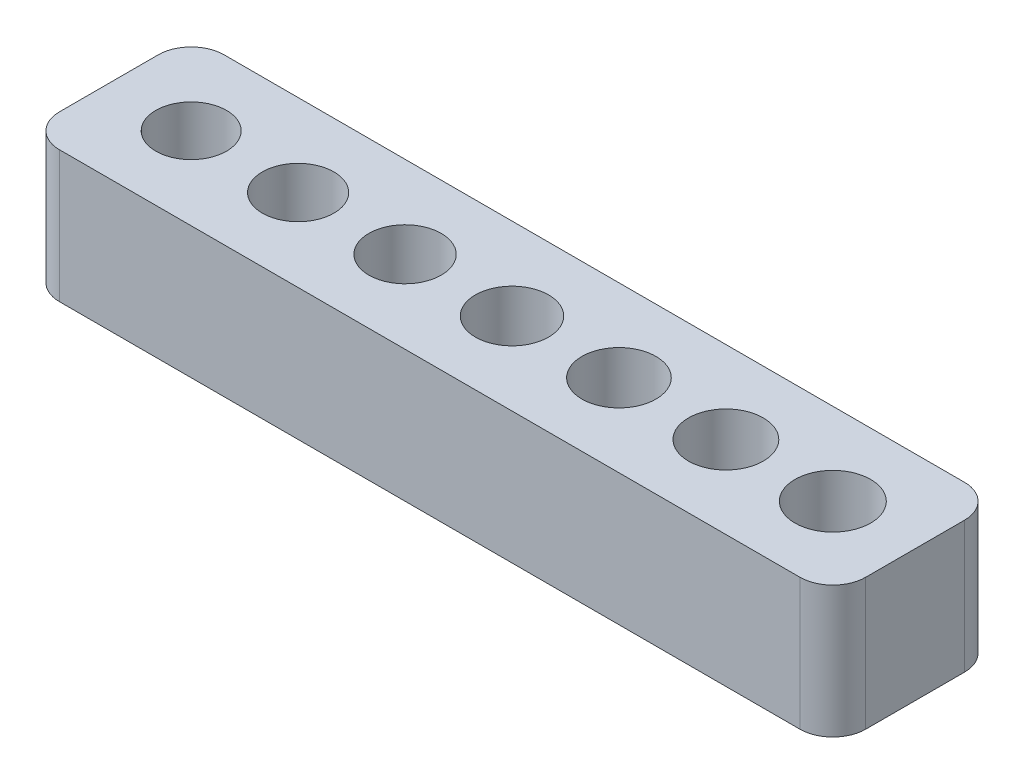
ISO-10303-21;
HEADER;
FILE_DESCRIPTION(('STEP AP214'),'2;1');
FILE_NAME('part.step','',(''),(''),'','','');
FILE_SCHEMA(('AUTOMOTIVE_DESIGN { 1 0 10303 214 1 1 1 1 }'));
ENDSEC;
DATA;
#1=APPLICATION_CONTEXT('core data for automotive mechanical design processes');
#2=APPLICATION_PROTOCOL_DEFINITION('international standard','automotive_design',2000,#1);
#3=PRODUCT_CONTEXT('',#1,'mechanical');
#4=PRODUCT('Part','Part','',(#3));
#5=PRODUCT_RELATED_PRODUCT_CATEGORY('part','',(#4));
#6=PRODUCT_DEFINITION_FORMATION('','',#4);
#7=PRODUCT_DEFINITION_CONTEXT('part definition',#1,'design');
#8=PRODUCT_DEFINITION('design','',#6,#7);
#9=PRODUCT_DEFINITION_SHAPE('','',#8);
#10=(LENGTH_UNIT() NAMED_UNIT(*) SI_UNIT(.MILLI.,.METRE.));
#11=(NAMED_UNIT(*) PLANE_ANGLE_UNIT() SI_UNIT($,.RADIAN.));
#12=(NAMED_UNIT(*) SI_UNIT($,.STERADIAN.) SOLID_ANGLE_UNIT());
#13=UNCERTAINTY_MEASURE_WITH_UNIT(LENGTH_MEASURE(1.E-05),#10,'distance_accuracy_value','');
#14=(GEOMETRIC_REPRESENTATION_CONTEXT(3) GLOBAL_UNCERTAINTY_ASSIGNED_CONTEXT((#13)) GLOBAL_UNIT_ASSIGNED_CONTEXT((#10,
#11,#12)) REPRESENTATION_CONTEXT('',''));
#15=CARTESIAN_POINT('',(0.,0.,0.));
#16=DIRECTION('',(0.,0.,1.));
#17=DIRECTION('',(1.,0.,0.));
#18=AXIS2_PLACEMENT_3D('',#15,#16,#17);
#19=CARTESIAN_POINT('',(0.,8.,0.));
#20=DIRECTION('',(0.,-1.,0.));
#21=DIRECTION('',(0.,0.,-1.));
#22=AXIS2_PLACEMENT_3D('',#19,#20,#21);
#23=PLANE('',#22);
#24=DIRECTION('',(1.,0.,0.));
#25=VECTOR('',#24,1.);
#26=CARTESIAN_POINT('',(0.,8.,0.));
#27=LINE('',#26,#25);
#28=CARTESIAN_POINT('',(2.,8.,0.));
#29=VERTEX_POINT('',#28);
#30=CARTESIAN_POINT('',(47.,8.,0.));
#31=VERTEX_POINT('',#30);
#32=EDGE_CURVE('E201',#29,#31,#27,.T.);
#33=ORIENTED_EDGE('',*,*,#32,.T.);
#34=CARTESIAN_POINT('',(47.,8.,-2.));
#35=DIRECTION('',(0.,-1.,0.));
#36=DIRECTION('',(0.,0.,-1.));
#37=AXIS2_PLACEMENT_3D('',#34,#35,#36);
#38=CIRCLE('',#37,2.);
#39=CARTESIAN_POINT('',(49.,8.,-2.));
#40=VERTEX_POINT('',#39);
#41=EDGE_CURVE('E174',#31,#40,#38,.F.);
#42=ORIENTED_EDGE('',*,*,#41,.T.);
#43=DIRECTION('',(0.,0.,-1.));
#44=VECTOR('',#43,1.);
#45=CARTESIAN_POINT('',(49.,8.,0.));
#46=LINE('',#45,#44);
#47=CARTESIAN_POINT('',(49.,8.,-8.));
#48=VERTEX_POINT('',#47);
#49=EDGE_CURVE('E131',#40,#48,#46,.T.);
#50=ORIENTED_EDGE('',*,*,#49,.T.);
#51=CARTESIAN_POINT('',(47.,8.,-8.));
#52=DIRECTION('',(0.,-1.,0.));
#53=DIRECTION('',(0.,0.,-1.));
#54=AXIS2_PLACEMENT_3D('',#51,#52,#53);
#55=CIRCLE('',#54,2.);
#56=CARTESIAN_POINT('',(47.,8.,-10.));
#57=VERTEX_POINT('',#56);
#58=EDGE_CURVE('E66',#48,#57,#55,.F.);
#59=ORIENTED_EDGE('',*,*,#58,.T.);
#60=DIRECTION('',(-1.,0.,0.));
#61=VECTOR('',#60,1.);
#62=CARTESIAN_POINT('',(0.,8.,-10.));
#63=LINE('',#62,#61);
#64=CARTESIAN_POINT('',(2.,8.,-10.));
#65=VERTEX_POINT('',#64);
#66=EDGE_CURVE('E153',#57,#65,#63,.T.);
#67=ORIENTED_EDGE('',*,*,#66,.T.);
#68=CARTESIAN_POINT('',(2.,8.,-8.));
#69=DIRECTION('',(0.,-1.,0.));
#70=DIRECTION('',(0.,0.,-1.));
#71=AXIS2_PLACEMENT_3D('',#68,#69,#70);
#72=CIRCLE('',#71,2.);
#73=CARTESIAN_POINT('',(0.,8.,-8.));
#74=VERTEX_POINT('',#73);
#75=EDGE_CURVE('E171',#65,#74,#72,.F.);
#76=ORIENTED_EDGE('',*,*,#75,.T.);
#77=DIRECTION('',(0.,0.,1.));
#78=VECTOR('',#77,1.);
#79=CARTESIAN_POINT('',(0.,8.,0.));
#80=LINE('',#79,#78);
#81=CARTESIAN_POINT('',(0.,8.,-2.));
#82=VERTEX_POINT('',#81);
#83=EDGE_CURVE('E146',#74,#82,#80,.T.);
#84=ORIENTED_EDGE('',*,*,#83,.T.);
#85=CARTESIAN_POINT('',(2.,8.,-2.));
#86=DIRECTION('',(0.,-1.,0.));
#87=DIRECTION('',(0.,0.,-1.));
#88=AXIS2_PLACEMENT_3D('',#85,#86,#87);
#89=CIRCLE('',#88,2.);
#90=EDGE_CURVE('E166',#82,#29,#89,.F.);
#91=ORIENTED_EDGE('',*,*,#90,.T.);
#92=EDGE_LOOP('',(#33,#42,#50,#59,#67,#76,#84,#91));
#93=FACE_BOUND('',#92,.T.);
#94=CARTESIAN_POINT('',(37.5,8.,-5.));
#95=DIRECTION('',(0.,1.,0.));
#96=DIRECTION('',(0.,0.,1.));
#97=AXIS2_PLACEMENT_3D('',#94,#95,#96);
#98=CIRCLE('',#97,2.275);
#99=CARTESIAN_POINT('',(37.5,8.,-2.725));
#100=VERTEX_POINT('',#99);
#101=EDGE_CURVE('E214',#100,#100,#98,.T.);
#102=ORIENTED_EDGE('',*,*,#101,.F.);
#103=EDGE_LOOP('',(#102));
#104=FACE_BOUND('',#103,.T.);
#105=CARTESIAN_POINT('',(31.,8.,-5.));
#106=DIRECTION('',(0.,1.,0.));
#107=DIRECTION('',(0.,0.,1.));
#108=AXIS2_PLACEMENT_3D('',#105,#106,#107);
#109=CIRCLE('',#108,2.25000000000001);
#110=CARTESIAN_POINT('',(31.,8.,-2.74999999999999));
#111=VERTEX_POINT('',#110);
#112=EDGE_CURVE('E221',#111,#111,#109,.T.);
#113=ORIENTED_EDGE('',*,*,#112,.F.);
#114=EDGE_LOOP('',(#113));
#115=FACE_BOUND('',#114,.T.);
#116=CARTESIAN_POINT('',(5.,8.,-5.));
#117=DIRECTION('',(0.,1.,0.));
#118=DIRECTION('',(0.,0.,1.));
#119=AXIS2_PLACEMENT_3D('',#116,#117,#118);
#120=CIRCLE('',#119,2.15);
#121=CARTESIAN_POINT('',(5.,8.,-2.85));
#122=VERTEX_POINT('',#121);
#123=EDGE_CURVE('E227',#122,#122,#120,.T.);
#124=ORIENTED_EDGE('',*,*,#123,.F.);
#125=EDGE_LOOP('',(#124));
#126=FACE_BOUND('',#125,.T.);
#127=CARTESIAN_POINT('',(11.5,8.,-5.));
#128=DIRECTION('',(0.,1.,0.));
#129=DIRECTION('',(0.,0.,1.));
#130=AXIS2_PLACEMENT_3D('',#127,#128,#129);
#131=CIRCLE('',#130,2.175);
#132=CARTESIAN_POINT('',(11.5,8.,-2.825));
#133=VERTEX_POINT('',#132);
#134=EDGE_CURVE('E235',#133,#133,#131,.T.);
#135=ORIENTED_EDGE('',*,*,#134,.F.);
#136=EDGE_LOOP('',(#135));
#137=FACE_BOUND('',#136,.T.);
#138=CARTESIAN_POINT('',(18.,8.,-5.));
#139=DIRECTION('',(0.,1.,0.));
#140=DIRECTION('',(0.,0.,1.));
#141=AXIS2_PLACEMENT_3D('',#138,#139,#140);
#142=CIRCLE('',#141,2.20000000000001);
#143=CARTESIAN_POINT('',(18.,8.,-2.79999999999999));
#144=VERTEX_POINT('',#143);
#145=EDGE_CURVE('E243',#144,#144,#142,.T.);
#146=ORIENTED_EDGE('',*,*,#145,.F.);
#147=EDGE_LOOP('',(#146));
#148=FACE_BOUND('',#147,.T.);
#149=CARTESIAN_POINT('',(24.5,8.,-5.));
#150=DIRECTION('',(0.,1.,0.));
#151=DIRECTION('',(0.,0.,1.));
#152=AXIS2_PLACEMENT_3D('',#149,#150,#151);
#153=CIRCLE('',#152,2.225);
#154=CARTESIAN_POINT('',(24.5,8.,-2.775));
#155=VERTEX_POINT('',#154);
#156=EDGE_CURVE('E251',#155,#155,#153,.T.);
#157=ORIENTED_EDGE('',*,*,#156,.F.);
#158=EDGE_LOOP('',(#157));
#159=FACE_BOUND('',#158,.T.);
#160=CARTESIAN_POINT('',(44.,8.,-5.));
#161=DIRECTION('',(0.,1.,0.));
#162=DIRECTION('',(0.,0.,1.));
#163=AXIS2_PLACEMENT_3D('',#160,#161,#162);
#164=CIRCLE('',#163,2.30000000000001);
#165=CARTESIAN_POINT('',(44.,8.,-2.69999999999999));
#166=VERTEX_POINT('',#165);
#167=EDGE_CURVE('E259',#166,#166,#164,.T.);
#168=ORIENTED_EDGE('',*,*,#167,.F.);
#169=EDGE_LOOP('',(#168));
#170=FACE_BOUND('',#169,.T.);
#171=ADVANCED_FACE('F45',(#93,#104,#115,#126,#137,#148,#159,#170),#23,.F.);
#172=CARTESIAN_POINT('',(0.,0.,0.));
#173=DIRECTION('',(0.,-1.,0.));
#174=DIRECTION('',(0.,0.,-1.));
#175=AXIS2_PLACEMENT_3D('',#172,#173,#174);
#176=PLANE('',#175);
#177=CARTESIAN_POINT('',(24.5,0.,-5.));
#178=DIRECTION('',(0.,1.,0.));
#179=DIRECTION('',(0.,0.,1.));
#180=AXIS2_PLACEMENT_3D('',#177,#178,#179);
#181=CIRCLE('',#180,2.225);
#182=CARTESIAN_POINT('',(24.5,0.,-2.775));
#183=VERTEX_POINT('',#182);
#184=EDGE_CURVE('E255',#183,#183,#181,.T.);
#185=ORIENTED_EDGE('',*,*,#184,.T.);
#186=EDGE_LOOP('',(#185));
#187=FACE_BOUND('',#186,.T.);
#188=CARTESIAN_POINT('',(11.5,0.,-5.));
#189=DIRECTION('',(0.,1.,0.));
#190=DIRECTION('',(0.,0.,1.));
#191=AXIS2_PLACEMENT_3D('',#188,#189,#190);
#192=CIRCLE('',#191,2.175);
#193=CARTESIAN_POINT('',(11.5,0.,-2.825));
#194=VERTEX_POINT('',#193);
#195=EDGE_CURVE('E239',#194,#194,#192,.T.);
#196=ORIENTED_EDGE('',*,*,#195,.T.);
#197=EDGE_LOOP('',(#196));
#198=FACE_BOUND('',#197,.T.);
#199=CARTESIAN_POINT('',(31.,0.,-5.));
#200=DIRECTION('',(0.,1.,0.));
#201=DIRECTION('',(0.,0.,1.));
#202=AXIS2_PLACEMENT_3D('',#199,#200,#201);
#203=CIRCLE('',#202,2.25000000000001);
#204=CARTESIAN_POINT('',(31.,0.,-2.74999999999999));
#205=VERTEX_POINT('',#204);
#206=EDGE_CURVE('E223',#205,#205,#203,.T.);
#207=ORIENTED_EDGE('',*,*,#206,.T.);
#208=EDGE_LOOP('',(#207));
#209=FACE_BOUND('',#208,.T.);
#210=DIRECTION('',(0.,0.,-1.));
#211=VECTOR('',#210,1.);
#212=CARTESIAN_POINT('',(49.,0.,0.));
#213=LINE('',#212,#211);
#214=CARTESIAN_POINT('',(49.,0.,-2.));
#215=VERTEX_POINT('',#214);
#216=CARTESIAN_POINT('',(49.,0.,-8.));
#217=VERTEX_POINT('',#216);
#218=EDGE_CURVE('E129',#215,#217,#213,.T.);
#219=ORIENTED_EDGE('',*,*,#218,.F.);
#220=CARTESIAN_POINT('',(47.,0.,-2.));
#221=DIRECTION('',(0.,-1.,0.));
#222=DIRECTION('',(0.,0.,-1.));
#223=AXIS2_PLACEMENT_3D('',#220,#221,#222);
#224=CIRCLE('',#223,2.);
#225=CARTESIAN_POINT('',(47.,0.,0.));
#226=VERTEX_POINT('',#225);
#227=EDGE_CURVE('E111',#215,#226,#224,.T.);
#228=ORIENTED_EDGE('',*,*,#227,.T.);
#229=DIRECTION('',(1.,0.,0.));
#230=VECTOR('',#229,1.);
#231=CARTESIAN_POINT('',(0.,0.,0.));
#232=LINE('',#231,#230);
#233=CARTESIAN_POINT('',(2.,0.,0.));
#234=VERTEX_POINT('',#233);
#235=EDGE_CURVE('E142',#234,#226,#232,.T.);
#236=ORIENTED_EDGE('',*,*,#235,.F.);
#237=CARTESIAN_POINT('',(2.,0.,-2.));
#238=DIRECTION('',(0.,-1.,0.));
#239=DIRECTION('',(0.,0.,-1.));
#240=AXIS2_PLACEMENT_3D('',#237,#238,#239);
#241=CIRCLE('',#240,2.);
#242=CARTESIAN_POINT('',(0.,0.,-2.));
#243=VERTEX_POINT('',#242);
#244=EDGE_CURVE('E133',#234,#243,#241,.T.);
#245=ORIENTED_EDGE('',*,*,#244,.T.);
#246=DIRECTION('',(0.,0.,1.));
#247=VECTOR('',#246,1.);
#248=CARTESIAN_POINT('',(0.,0.,0.));
#249=LINE('',#248,#247);
#250=CARTESIAN_POINT('',(0.,0.,-8.));
#251=VERTEX_POINT('',#250);
#252=EDGE_CURVE('E148',#251,#243,#249,.T.);
#253=ORIENTED_EDGE('',*,*,#252,.F.);
#254=CARTESIAN_POINT('',(2.,0.,-8.));
#255=DIRECTION('',(0.,-1.,0.));
#256=DIRECTION('',(0.,0.,-1.));
#257=AXIS2_PLACEMENT_3D('',#254,#255,#256);
#258=CIRCLE('',#257,2.);
#259=CARTESIAN_POINT('',(2.,0.,-10.));
#260=VERTEX_POINT('',#259);
#261=EDGE_CURVE('E123',#251,#260,#258,.T.);
#262=ORIENTED_EDGE('',*,*,#261,.T.);
#263=DIRECTION('',(-1.,0.,0.));
#264=VECTOR('',#263,1.);
#265=CARTESIAN_POINT('',(0.,0.,-10.));
#266=LINE('',#265,#264);
#267=CARTESIAN_POINT('',(47.,0.,-10.));
#268=VERTEX_POINT('',#267);
#269=EDGE_CURVE('E141',#268,#260,#266,.T.);
#270=ORIENTED_EDGE('',*,*,#269,.F.);
#271=CARTESIAN_POINT('',(47.,0.,-8.));
#272=DIRECTION('',(0.,-1.,0.));
#273=DIRECTION('',(0.,0.,-1.));
#274=AXIS2_PLACEMENT_3D('',#271,#272,#273);
#275=CIRCLE('',#274,2.);
#276=EDGE_CURVE('E139',#268,#217,#275,.T.);
#277=ORIENTED_EDGE('',*,*,#276,.T.);
#278=EDGE_LOOP('',(#219,#228,#236,#245,#253,#262,#270,#277));
#279=FACE_BOUND('',#278,.T.);
#280=CARTESIAN_POINT('',(37.5,0.,-5.));
#281=DIRECTION('',(0.,1.,0.));
#282=DIRECTION('',(0.,0.,1.));
#283=AXIS2_PLACEMENT_3D('',#280,#281,#282);
#284=CIRCLE('',#283,2.275);
#285=CARTESIAN_POINT('',(37.5,0.,-2.725));
#286=VERTEX_POINT('',#285);
#287=EDGE_CURVE('E207',#286,#286,#284,.T.);
#288=ORIENTED_EDGE('',*,*,#287,.T.);
#289=EDGE_LOOP('',(#288));
#290=FACE_BOUND('',#289,.T.);
#291=CARTESIAN_POINT('',(5.,0.,-5.));
#292=DIRECTION('',(0.,1.,0.));
#293=DIRECTION('',(0.,0.,1.));
#294=AXIS2_PLACEMENT_3D('',#291,#292,#293);
#295=CIRCLE('',#294,2.15);
#296=CARTESIAN_POINT('',(5.,0.,-2.85));
#297=VERTEX_POINT('',#296);
#298=EDGE_CURVE('E231',#297,#297,#295,.T.);
#299=ORIENTED_EDGE('',*,*,#298,.T.);
#300=EDGE_LOOP('',(#299));
#301=FACE_BOUND('',#300,.T.);
#302=CARTESIAN_POINT('',(18.,0.,-5.));
#303=DIRECTION('',(0.,1.,0.));
#304=DIRECTION('',(0.,0.,1.));
#305=AXIS2_PLACEMENT_3D('',#302,#303,#304);
#306=CIRCLE('',#305,2.20000000000001);
#307=CARTESIAN_POINT('',(18.,0.,-2.79999999999999));
#308=VERTEX_POINT('',#307);
#309=EDGE_CURVE('E247',#308,#308,#306,.T.);
#310=ORIENTED_EDGE('',*,*,#309,.T.);
#311=EDGE_LOOP('',(#310));
#312=FACE_BOUND('',#311,.T.);
#313=CARTESIAN_POINT('',(44.,0.,-5.));
#314=DIRECTION('',(0.,1.,0.));
#315=DIRECTION('',(0.,0.,1.));
#316=AXIS2_PLACEMENT_3D('',#313,#314,#315);
#317=CIRCLE('',#316,2.30000000000001);
#318=CARTESIAN_POINT('',(44.,0.,-2.69999999999999));
#319=VERTEX_POINT('',#318);
#320=EDGE_CURVE('E263',#319,#319,#317,.T.);
#321=ORIENTED_EDGE('',*,*,#320,.T.);
#322=EDGE_LOOP('',(#321));
#323=FACE_BOUND('',#322,.T.);
#324=ADVANCED_FACE('F136',(#187,#198,#209,#279,#290,#301,#312,#323),#176,.T.);
#325=CARTESIAN_POINT('',(0.,8.,0.));
#326=DIRECTION('',(1.,0.,0.));
#327=DIRECTION('',(0.,0.,-1.));
#328=AXIS2_PLACEMENT_3D('',#325,#326,#327);
#329=PLANE('',#328);
#330=ORIENTED_EDGE('',*,*,#83,.F.);
#331=DIRECTION('',(0.,-1.,0.));
#332=VECTOR('',#331,1.);
#333=CARTESIAN_POINT('',(0.,8.,-8.));
#334=LINE('',#333,#332);
#335=EDGE_CURVE('E180',#74,#251,#334,.T.);
#336=ORIENTED_EDGE('',*,*,#335,.T.);
#337=ORIENTED_EDGE('',*,*,#252,.T.);
#338=DIRECTION('',(0.,-1.,0.));
#339=VECTOR('',#338,1.);
#340=CARTESIAN_POINT('',(0.,8.,-2.));
#341=LINE('',#340,#339);
#342=EDGE_CURVE('E177',#243,#82,#341,.F.);
#343=ORIENTED_EDGE('',*,*,#342,.T.);
#344=EDGE_LOOP('',(#330,#336,#337,#343));
#345=FACE_BOUND('',#344,.T.);
#346=ADVANCED_FACE('F196',(#345),#329,.F.);
#347=CARTESIAN_POINT('',(0.,8.,0.));
#348=DIRECTION('',(0.,0.,-1.));
#349=DIRECTION('',(-1.,0.,0.));
#350=AXIS2_PLACEMENT_3D('',#347,#348,#349);
#351=PLANE('',#350);
#352=ORIENTED_EDGE('',*,*,#235,.T.);
#353=DIRECTION('',(0.,-1.,0.));
#354=VECTOR('',#353,1.);
#355=CARTESIAN_POINT('',(47.,8.,0.));
#356=LINE('',#355,#354);
#357=EDGE_CURVE('E116',#226,#31,#356,.F.);
#358=ORIENTED_EDGE('',*,*,#357,.T.);
#359=ORIENTED_EDGE('',*,*,#32,.F.);
#360=DIRECTION('',(0.,-1.,0.));
#361=VECTOR('',#360,1.);
#362=CARTESIAN_POINT('',(2.,8.,0.));
#363=LINE('',#362,#361);
#364=EDGE_CURVE('E122',#29,#234,#363,.T.);
#365=ORIENTED_EDGE('',*,*,#364,.T.);
#366=EDGE_LOOP('',(#352,#358,#359,#365));
#367=FACE_BOUND('',#366,.T.);
#368=ADVANCED_FACE('F291',(#367),#351,.F.);
#369=CARTESIAN_POINT('',(49.,8.,0.));
#370=DIRECTION('',(-1.,0.,0.));
#371=DIRECTION('',(0.,0.,1.));
#372=AXIS2_PLACEMENT_3D('',#369,#370,#371);
#373=PLANE('',#372);
#374=ORIENTED_EDGE('',*,*,#49,.F.);
#375=DIRECTION('',(0.,-1.,0.));
#376=VECTOR('',#375,1.);
#377=CARTESIAN_POINT('',(49.,8.,-2.));
#378=LINE('',#377,#376);
#379=EDGE_CURVE('E115',#40,#215,#378,.T.);
#380=ORIENTED_EDGE('',*,*,#379,.T.);
#381=ORIENTED_EDGE('',*,*,#218,.T.);
#382=DIRECTION('',(0.,-1.,0.));
#383=VECTOR('',#382,1.);
#384=CARTESIAN_POINT('',(49.,8.,-8.));
#385=LINE('',#384,#383);
#386=EDGE_CURVE('E134',#217,#48,#385,.F.);
#387=ORIENTED_EDGE('',*,*,#386,.T.);
#388=EDGE_LOOP('',(#374,#380,#381,#387));
#389=FACE_BOUND('',#388,.T.);
#390=ADVANCED_FACE('F128',(#389),#373,.F.);
#391=CARTESIAN_POINT('',(0.,8.,-10.));
#392=DIRECTION('',(0.,0.,1.));
#393=DIRECTION('',(1.,0.,0.));
#394=AXIS2_PLACEMENT_3D('',#391,#392,#393);
#395=PLANE('',#394);
#396=ORIENTED_EDGE('',*,*,#269,.T.);
#397=DIRECTION('',(0.,-1.,0.));
#398=VECTOR('',#397,1.);
#399=CARTESIAN_POINT('',(2.,8.,-10.));
#400=LINE('',#399,#398);
#401=EDGE_CURVE('E11',#260,#65,#400,.F.);
#402=ORIENTED_EDGE('',*,*,#401,.T.);
#403=ORIENTED_EDGE('',*,*,#66,.F.);
#404=DIRECTION('',(0.,-1.,0.));
#405=VECTOR('',#404,1.);
#406=CARTESIAN_POINT('',(47.,8.,-10.));
#407=LINE('',#406,#405);
#408=EDGE_CURVE('E54',#57,#268,#407,.T.);
#409=ORIENTED_EDGE('',*,*,#408,.T.);
#410=EDGE_LOOP('',(#396,#402,#403,#409));
#411=FACE_BOUND('',#410,.T.);
#412=ADVANCED_FACE('F186',(#411),#395,.F.);
#413=CARTESIAN_POINT('',(37.5,8.,-5.));
#414=DIRECTION('',(0.,-1.,0.));
#415=DIRECTION('',(0.,0.,-1.));
#416=AXIS2_PLACEMENT_3D('',#413,#414,#415);
#417=CYLINDRICAL_SURFACE('',#416,2.275);
#418=ORIENTED_EDGE('',*,*,#101,.T.);
#419=EDGE_LOOP('',(#418));
#420=FACE_BOUND('',#419,.T.);
#421=ORIENTED_EDGE('',*,*,#287,.F.);
#422=EDGE_LOOP('',(#421));
#423=FACE_BOUND('',#422,.T.);
#424=ADVANCED_FACE('F284',(#420,#423),#417,.F.);
#425=CARTESIAN_POINT('',(31.,8.,-5.));
#426=DIRECTION('',(0.,-1.,0.));
#427=DIRECTION('',(0.,0.,-1.));
#428=AXIS2_PLACEMENT_3D('',#425,#426,#427);
#429=CYLINDRICAL_SURFACE('',#428,2.25000000000001);
#430=ORIENTED_EDGE('',*,*,#112,.T.);
#431=EDGE_LOOP('',(#430));
#432=FACE_BOUND('',#431,.T.);
#433=ORIENTED_EDGE('',*,*,#206,.F.);
#434=EDGE_LOOP('',(#433));
#435=FACE_BOUND('',#434,.T.);
#436=ADVANCED_FACE('F374',(#432,#435),#429,.F.);
#437=CARTESIAN_POINT('',(5.,8.,-5.));
#438=DIRECTION('',(0.,-1.,0.));
#439=DIRECTION('',(0.,0.,-1.));
#440=AXIS2_PLACEMENT_3D('',#437,#438,#439);
#441=CYLINDRICAL_SURFACE('',#440,2.15);
#442=ORIENTED_EDGE('',*,*,#123,.T.);
#443=EDGE_LOOP('',(#442));
#444=FACE_BOUND('',#443,.T.);
#445=ORIENTED_EDGE('',*,*,#298,.F.);
#446=EDGE_LOOP('',(#445));
#447=FACE_BOUND('',#446,.T.);
#448=ADVANCED_FACE('F364',(#444,#447),#441,.F.);
#449=CARTESIAN_POINT('',(11.5,8.,-5.));
#450=DIRECTION('',(0.,-1.,0.));
#451=DIRECTION('',(0.,0.,-1.));
#452=AXIS2_PLACEMENT_3D('',#449,#450,#451);
#453=CYLINDRICAL_SURFACE('',#452,2.175);
#454=ORIENTED_EDGE('',*,*,#134,.T.);
#455=EDGE_LOOP('',(#454));
#456=FACE_BOUND('',#455,.T.);
#457=ORIENTED_EDGE('',*,*,#195,.F.);
#458=EDGE_LOOP('',(#457));
#459=FACE_BOUND('',#458,.T.);
#460=ADVANCED_FACE('F354',(#456,#459),#453,.F.);
#461=CARTESIAN_POINT('',(18.,8.,-5.));
#462=DIRECTION('',(0.,-1.,0.));
#463=DIRECTION('',(0.,0.,-1.));
#464=AXIS2_PLACEMENT_3D('',#461,#462,#463);
#465=CYLINDRICAL_SURFACE('',#464,2.20000000000001);
#466=ORIENTED_EDGE('',*,*,#145,.T.);
#467=EDGE_LOOP('',(#466));
#468=FACE_BOUND('',#467,.T.);
#469=ORIENTED_EDGE('',*,*,#309,.F.);
#470=EDGE_LOOP('',(#469));
#471=FACE_BOUND('',#470,.T.);
#472=ADVANCED_FACE('F344',(#468,#471),#465,.F.);
#473=CARTESIAN_POINT('',(24.5,8.,-5.));
#474=DIRECTION('',(0.,-1.,0.));
#475=DIRECTION('',(0.,0.,-1.));
#476=AXIS2_PLACEMENT_3D('',#473,#474,#475);
#477=CYLINDRICAL_SURFACE('',#476,2.225);
#478=ORIENTED_EDGE('',*,*,#156,.T.);
#479=EDGE_LOOP('',(#478));
#480=FACE_BOUND('',#479,.T.);
#481=ORIENTED_EDGE('',*,*,#184,.F.);
#482=EDGE_LOOP('',(#481));
#483=FACE_BOUND('',#482,.T.);
#484=ADVANCED_FACE('F335',(#480,#483),#477,.F.);
#485=CARTESIAN_POINT('',(44.,8.,-5.));
#486=DIRECTION('',(0.,-1.,0.));
#487=DIRECTION('',(0.,0.,-1.));
#488=AXIS2_PLACEMENT_3D('',#485,#486,#487);
#489=CYLINDRICAL_SURFACE('',#488,2.30000000000001);
#490=ORIENTED_EDGE('',*,*,#167,.T.);
#491=EDGE_LOOP('',(#490));
#492=FACE_BOUND('',#491,.T.);
#493=ORIENTED_EDGE('',*,*,#320,.F.);
#494=EDGE_LOOP('',(#493));
#495=FACE_BOUND('',#494,.T.);
#496=ADVANCED_FACE('F271',(#492,#495),#489,.F.);
#497=CARTESIAN_POINT('',(47.,8.,-2.));
#498=DIRECTION('',(0.,-1.,0.));
#499=DIRECTION('',(0.,0.,-1.));
#500=AXIS2_PLACEMENT_3D('',#497,#498,#499);
#501=CYLINDRICAL_SURFACE('',#500,2.);
#502=ORIENTED_EDGE('',*,*,#41,.F.);
#503=ORIENTED_EDGE('',*,*,#357,.F.);
#504=ORIENTED_EDGE('',*,*,#227,.F.);
#505=ORIENTED_EDGE('',*,*,#379,.F.);
#506=EDGE_LOOP('',(#502,#503,#504,#505));
#507=FACE_BOUND('',#506,.T.);
#508=ADVANCED_FACE('F114',(#507),#501,.T.);
#509=CARTESIAN_POINT('',(2.,8.,-8.));
#510=DIRECTION('',(0.,-1.,0.));
#511=DIRECTION('',(0.,0.,-1.));
#512=AXIS2_PLACEMENT_3D('',#509,#510,#511);
#513=CYLINDRICAL_SURFACE('',#512,2.);
#514=ORIENTED_EDGE('',*,*,#75,.F.);
#515=ORIENTED_EDGE('',*,*,#401,.F.);
#516=ORIENTED_EDGE('',*,*,#261,.F.);
#517=ORIENTED_EDGE('',*,*,#335,.F.);
#518=EDGE_LOOP('',(#514,#515,#516,#517));
#519=FACE_BOUND('',#518,.T.);
#520=ADVANCED_FACE('F193',(#519),#513,.T.);
#521=CARTESIAN_POINT('',(47.,8.,-8.));
#522=DIRECTION('',(0.,-1.,0.));
#523=DIRECTION('',(0.,0.,-1.));
#524=AXIS2_PLACEMENT_3D('',#521,#522,#523);
#525=CYLINDRICAL_SURFACE('',#524,2.);
#526=ORIENTED_EDGE('',*,*,#58,.F.);
#527=ORIENTED_EDGE('',*,*,#386,.F.);
#528=ORIENTED_EDGE('',*,*,#276,.F.);
#529=ORIENTED_EDGE('',*,*,#408,.F.);
#530=EDGE_LOOP('',(#526,#527,#528,#529));
#531=FACE_BOUND('',#530,.T.);
#532=ADVANCED_FACE('F300',(#531),#525,.T.);
#533=CARTESIAN_POINT('',(2.,8.,-2.));
#534=DIRECTION('',(0.,-1.,0.));
#535=DIRECTION('',(0.,0.,-1.));
#536=AXIS2_PLACEMENT_3D('',#533,#534,#535);
#537=CYLINDRICAL_SURFACE('',#536,2.);
#538=ORIENTED_EDGE('',*,*,#90,.F.);
#539=ORIENTED_EDGE('',*,*,#342,.F.);
#540=ORIENTED_EDGE('',*,*,#244,.F.);
#541=ORIENTED_EDGE('',*,*,#364,.F.);
#542=EDGE_LOOP('',(#538,#539,#540,#541));
#543=FACE_BOUND('',#542,.T.);
#544=ADVANCED_FACE('F47',(#543),#537,.T.);
#545=CLOSED_SHELL('',(#171,#324,#346,#368,#390,#412,#424,#436,#448,#460,#472,#484,#496,#508,
#520,#532,#544));
#546=MANIFOLD_SOLID_BREP('B2',#545);
#547=ADVANCED_BREP_SHAPE_REPRESENTATION('',(#18,#546),#14);
#548=SHAPE_DEFINITION_REPRESENTATION(#9,#547);
ENDSEC;
END-ISO-10303-21;
